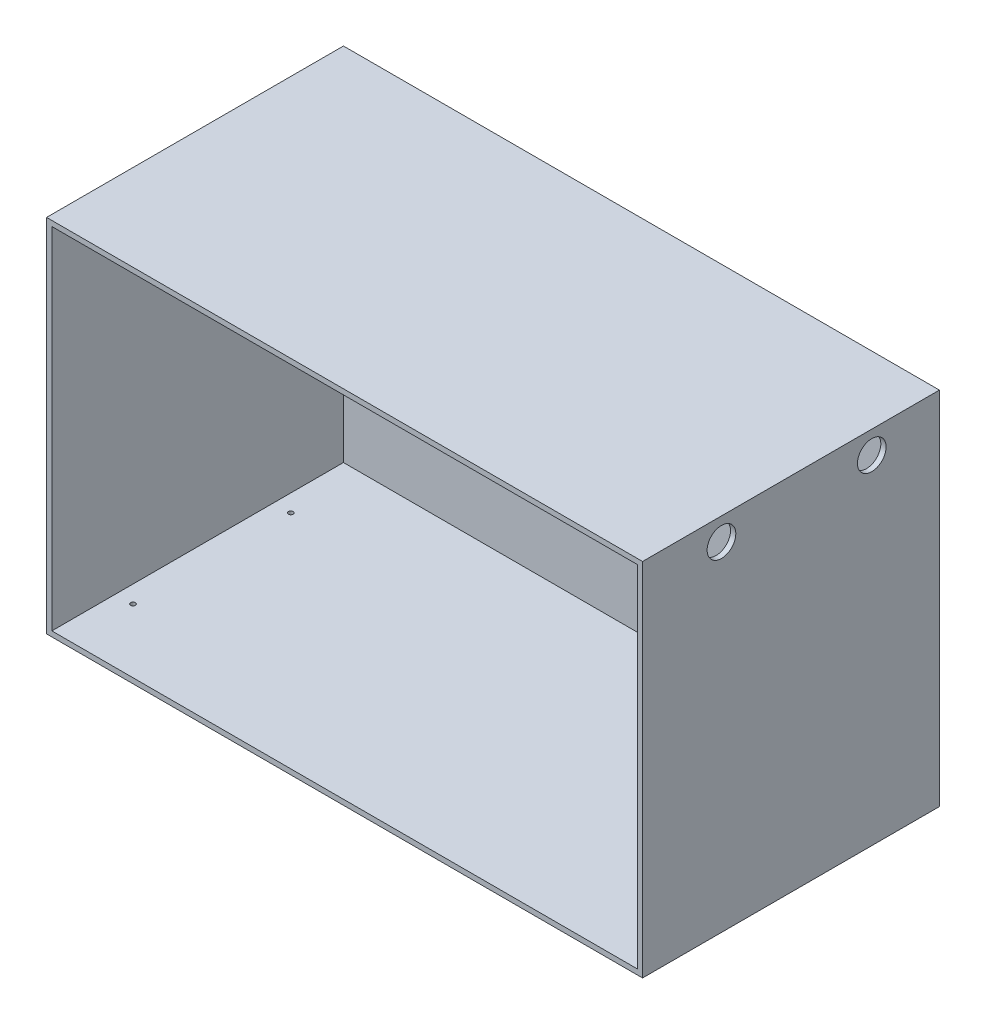
ISO-10303-21;
HEADER;
FILE_DESCRIPTION(('STEP AP214'),'2;1');
FILE_NAME('part.step','',(''),(''),'','','');
FILE_SCHEMA(('AUTOMOTIVE_DESIGN { 1 0 10303 214 1 1 1 1 }'));
ENDSEC;
DATA;
#1=APPLICATION_CONTEXT('core data for automotive mechanical design processes');
#2=APPLICATION_PROTOCOL_DEFINITION('international standard','automotive_design',2000,#1);
#3=PRODUCT_CONTEXT('',#1,'mechanical');
#4=PRODUCT('Part','Part','',(#3));
#5=PRODUCT_RELATED_PRODUCT_CATEGORY('part','',(#4));
#6=PRODUCT_DEFINITION_FORMATION('','',#4);
#7=PRODUCT_DEFINITION_CONTEXT('part definition',#1,'design');
#8=PRODUCT_DEFINITION('design','',#6,#7);
#9=PRODUCT_DEFINITION_SHAPE('','',#8);
#10=(LENGTH_UNIT() NAMED_UNIT(*) SI_UNIT(.MILLI.,.METRE.));
#11=(NAMED_UNIT(*) PLANE_ANGLE_UNIT() SI_UNIT($,.RADIAN.));
#12=(NAMED_UNIT(*) SI_UNIT($,.STERADIAN.) SOLID_ANGLE_UNIT());
#13=UNCERTAINTY_MEASURE_WITH_UNIT(LENGTH_MEASURE(1.E-05),#10,'distance_accuracy_value','');
#14=(GEOMETRIC_REPRESENTATION_CONTEXT(3) GLOBAL_UNCERTAINTY_ASSIGNED_CONTEXT((#13)) GLOBAL_UNIT_ASSIGNED_CONTEXT((#10,
#11,#12)) REPRESENTATION_CONTEXT('',''));
#15=CARTESIAN_POINT('',(0.,0.,0.));
#16=DIRECTION('',(0.,0.,1.));
#17=DIRECTION('',(1.,0.,0.));
#18=AXIS2_PLACEMENT_3D('',#15,#16,#17);
#19=CARTESIAN_POINT('',(396.5,480.,-220.));
#20=DIRECTION('',(-1.,0.,0.));
#21=DIRECTION('',(0.,0.,1.));
#22=AXIS2_PLACEMENT_3D('',#19,#20,#21);
#23=PLANE('',#22);
#24=CARTESIAN_POINT('',(396.5,450.,70.));
#25=DIRECTION('',(-1.,0.,0.));
#26=DIRECTION('',(0.,0.,1.));
#27=AXIS2_PLACEMENT_3D('',#24,#25,#26);
#28=CIRCLE('',#27,19.05);
#29=CARTESIAN_POINT('',(396.5,450.,89.05));
#30=VERTEX_POINT('',#29);
#31=EDGE_CURVE('E168',#30,#30,#28,.T.);
#32=ORIENTED_EDGE('',*,*,#31,.T.);
#33=EDGE_LOOP('',(#32));
#34=FACE_BOUND('',#33,.T.);
#35=CARTESIAN_POINT('',(396.5,450.,-130.));
#36=DIRECTION('',(-1.,0.,0.));
#37=DIRECTION('',(0.,0.,1.));
#38=AXIS2_PLACEMENT_3D('',#35,#36,#37);
#39=CIRCLE('',#38,19.05);
#40=CARTESIAN_POINT('',(396.5,450.,-110.95));
#41=VERTEX_POINT('',#40);
#42=EDGE_CURVE('E175',#41,#41,#39,.T.);
#43=ORIENTED_EDGE('',*,*,#42,.T.);
#44=EDGE_LOOP('',(#43));
#45=FACE_BOUND('',#44,.T.);
#46=DIRECTION('',(0.,0.,-1.));
#47=VECTOR('',#46,1.);
#48=CARTESIAN_POINT('',(396.5,480.,-220.));
#49=LINE('',#48,#47);
#50=CARTESIAN_POINT('',(396.5,480.,175.));
#51=VERTEX_POINT('',#50);
#52=CARTESIAN_POINT('',(396.5,480.,-220.));
#53=VERTEX_POINT('',#52);
#54=EDGE_CURVE('E105',#51,#53,#49,.T.);
#55=ORIENTED_EDGE('',*,*,#54,.F.);
#56=DIRECTION('',(0.,1.,0.));
#57=VECTOR('',#56,1.);
#58=CARTESIAN_POINT('',(396.5,0.,175.));
#59=LINE('',#58,#57);
#60=CARTESIAN_POINT('',(396.5,0.,175.));
#61=VERTEX_POINT('',#60);
#62=EDGE_CURVE('E93',#61,#51,#59,.T.);
#63=ORIENTED_EDGE('',*,*,#62,.F.);
#64=DIRECTION('',(0.,0.,-1.));
#65=VECTOR('',#64,1.);
#66=CARTESIAN_POINT('',(396.5,0.,-220.));
#67=LINE('',#66,#65);
#68=CARTESIAN_POINT('',(396.5,0.,-220.));
#69=VERTEX_POINT('',#68);
#70=EDGE_CURVE('E125',#61,#69,#67,.T.);
#71=ORIENTED_EDGE('',*,*,#70,.T.);
#72=DIRECTION('',(0.,-1.,0.));
#73=VECTOR('',#72,1.);
#74=CARTESIAN_POINT('',(396.5,480.,-220.));
#75=LINE('',#74,#73);
#76=EDGE_CURVE('E39',#53,#69,#75,.T.);
#77=ORIENTED_EDGE('',*,*,#76,.F.);
#78=EDGE_LOOP('',(#55,#63,#71,#77));
#79=FACE_BOUND('',#78,.T.);
#80=ADVANCED_FACE('F32',(#34,#45,#79),#23,.F.);
#81=CARTESIAN_POINT('',(-396.5,480.,-220.));
#82=DIRECTION('',(0.,0.,1.));
#83=DIRECTION('',(1.,0.,0.));
#84=AXIS2_PLACEMENT_3D('',#81,#82,#83);
#85=PLANE('',#84);
#86=DIRECTION('',(-1.,0.,0.));
#87=VECTOR('',#86,1.);
#88=CARTESIAN_POINT('',(-396.5,0.,-220.));
#89=LINE('',#88,#87);
#90=CARTESIAN_POINT('',(-396.5,0.,-220.));
#91=VERTEX_POINT('',#90);
#92=EDGE_CURVE('E117',#69,#91,#89,.T.);
#93=ORIENTED_EDGE('',*,*,#92,.T.);
#94=DIRECTION('',(0.,-1.,0.));
#95=VECTOR('',#94,1.);
#96=CARTESIAN_POINT('',(-396.5,480.,-220.));
#97=LINE('',#96,#95);
#98=CARTESIAN_POINT('',(-396.5,480.,-220.));
#99=VERTEX_POINT('',#98);
#100=EDGE_CURVE('E124',#99,#91,#97,.T.);
#101=ORIENTED_EDGE('',*,*,#100,.F.);
#102=DIRECTION('',(-1.,0.,0.));
#103=VECTOR('',#102,1.);
#104=CARTESIAN_POINT('',(-396.5,480.,-220.));
#105=LINE('',#104,#103);
#106=EDGE_CURVE('E112',#53,#99,#105,.T.);
#107=ORIENTED_EDGE('',*,*,#106,.F.);
#108=ORIENTED_EDGE('',*,*,#76,.T.);
#109=EDGE_LOOP('',(#93,#101,#107,#108));
#110=FACE_BOUND('',#109,.T.);
#111=ADVANCED_FACE('F235',(#110),#85,.F.);
#112=CARTESIAN_POINT('',(-396.5,480.,-220.));
#113=DIRECTION('',(1.,0.,0.));
#114=DIRECTION('',(0.,0.,-1.));
#115=AXIS2_PLACEMENT_3D('',#112,#113,#114);
#116=PLANE('',#115);
#117=CARTESIAN_POINT('',(-396.5,450.,70.));
#118=DIRECTION('',(-1.,0.,0.));
#119=DIRECTION('',(0.,0.,1.));
#120=AXIS2_PLACEMENT_3D('',#117,#118,#119);
#121=CIRCLE('',#120,19.05);
#122=CARTESIAN_POINT('',(-396.5,450.,89.05));
#123=VERTEX_POINT('',#122);
#124=EDGE_CURVE('E141',#123,#123,#121,.T.);
#125=ORIENTED_EDGE('',*,*,#124,.F.);
#126=EDGE_LOOP('',(#125));
#127=FACE_BOUND('',#126,.T.);
#128=CARTESIAN_POINT('',(-396.5,450.,-130.));
#129=DIRECTION('',(-1.,0.,0.));
#130=DIRECTION('',(0.,0.,1.));
#131=AXIS2_PLACEMENT_3D('',#128,#129,#130);
#132=CIRCLE('',#131,19.05);
#133=CARTESIAN_POINT('',(-396.5,450.,-110.95));
#134=VERTEX_POINT('',#133);
#135=EDGE_CURVE('E136',#134,#134,#132,.T.);
#136=ORIENTED_EDGE('',*,*,#135,.F.);
#137=EDGE_LOOP('',(#136));
#138=FACE_BOUND('',#137,.T.);
#139=DIRECTION('',(0.,0.,1.));
#140=VECTOR('',#139,1.);
#141=CARTESIAN_POINT('',(-396.5,0.,-220.));
#142=LINE('',#141,#140);
#143=CARTESIAN_POINT('',(-396.5,0.,175.));
#144=VERTEX_POINT('',#143);
#145=EDGE_CURVE('E113',#91,#144,#142,.T.);
#146=ORIENTED_EDGE('',*,*,#145,.T.);
#147=DIRECTION('',(0.,-1.,0.));
#148=VECTOR('',#147,1.);
#149=CARTESIAN_POINT('',(-396.5,0.,175.));
#150=LINE('',#149,#148);
#151=CARTESIAN_POINT('',(-396.5,480.,175.));
#152=VERTEX_POINT('',#151);
#153=EDGE_CURVE('E46',#152,#144,#150,.T.);
#154=ORIENTED_EDGE('',*,*,#153,.F.);
#155=DIRECTION('',(0.,0.,1.));
#156=VECTOR('',#155,1.);
#157=CARTESIAN_POINT('',(-396.5,480.,-220.));
#158=LINE('',#157,#156);
#159=EDGE_CURVE('E108',#99,#152,#158,.T.);
#160=ORIENTED_EDGE('',*,*,#159,.F.);
#161=ORIENTED_EDGE('',*,*,#100,.T.);
#162=EDGE_LOOP('',(#146,#154,#160,#161));
#163=FACE_BOUND('',#162,.T.);
#164=ADVANCED_FACE('F237',(#127,#138,#163),#116,.F.);
#165=CARTESIAN_POINT('',(0.,480.,0.));
#166=DIRECTION('',(0.,1.,0.));
#167=DIRECTION('',(0.,0.,1.));
#168=AXIS2_PLACEMENT_3D('',#165,#166,#167);
#169=PLANE('',#168);
#170=DIRECTION('',(-1.,0.,0.));
#171=VECTOR('',#170,1.);
#172=CARTESIAN_POINT('',(-396.5,480.,175.));
#173=LINE('',#172,#171);
#174=EDGE_CURVE('E96',#51,#152,#173,.T.);
#175=ORIENTED_EDGE('',*,*,#174,.F.);
#176=ORIENTED_EDGE('',*,*,#54,.T.);
#177=ORIENTED_EDGE('',*,*,#106,.T.);
#178=ORIENTED_EDGE('',*,*,#159,.T.);
#179=EDGE_LOOP('',(#175,#176,#177,#178));
#180=FACE_BOUND('',#179,.T.);
#181=ADVANCED_FACE('F104',(#180),#169,.T.);
#182=CARTESIAN_POINT('',(0.,0.,0.));
#183=DIRECTION('',(0.,1.,0.));
#184=DIRECTION('',(0.,0.,1.));
#185=AXIS2_PLACEMENT_3D('',#182,#183,#184);
#186=PLANE('',#185);
#187=CARTESIAN_POINT('',(366.5,0.,-120.));
#188=DIRECTION('',(0.,-1.,0.));
#189=DIRECTION('',(0.,0.,1.));
#190=AXIS2_PLACEMENT_3D('',#187,#188,#189);
#191=CIRCLE('',#190,3.17499999999997);
#192=CARTESIAN_POINT('',(366.5,0.,-116.825));
#193=VERTEX_POINT('',#192);
#194=EDGE_CURVE('E150',#193,#193,#191,.T.);
#195=ORIENTED_EDGE('',*,*,#194,.F.);
#196=EDGE_LOOP('',(#195));
#197=FACE_BOUND('',#196,.T.);
#198=CARTESIAN_POINT('',(-366.5,0.,90.));
#199=DIRECTION('',(0.,-1.,0.));
#200=DIRECTION('',(0.,0.,1.));
#201=AXIS2_PLACEMENT_3D('',#198,#199,#200);
#202=CIRCLE('',#201,3.17499999999997);
#203=CARTESIAN_POINT('',(-366.5,0.,93.175));
#204=VERTEX_POINT('',#203);
#205=EDGE_CURVE('E215',#204,#204,#202,.T.);
#206=ORIENTED_EDGE('',*,*,#205,.F.);
#207=EDGE_LOOP('',(#206));
#208=FACE_BOUND('',#207,.T.);
#209=CARTESIAN_POINT('',(366.5,0.,90.));
#210=DIRECTION('',(0.,-1.,0.));
#211=DIRECTION('',(0.,0.,-1.));
#212=AXIS2_PLACEMENT_3D('',#209,#210,#211);
#213=CIRCLE('',#212,3.17499999999997);
#214=CARTESIAN_POINT('',(366.5,0.,86.825));
#215=VERTEX_POINT('',#214);
#216=EDGE_CURVE('E162',#215,#215,#213,.T.);
#217=ORIENTED_EDGE('',*,*,#216,.F.);
#218=EDGE_LOOP('',(#217));
#219=FACE_BOUND('',#218,.T.);
#220=CARTESIAN_POINT('',(-366.5,0.,-120.));
#221=DIRECTION('',(0.,-1.,0.));
#222=DIRECTION('',(0.,0.,-1.));
#223=AXIS2_PLACEMENT_3D('',#220,#221,#222);
#224=CIRCLE('',#223,3.17499999999997);
#225=CARTESIAN_POINT('',(-366.5,0.,-123.175));
#226=VERTEX_POINT('',#225);
#227=EDGE_CURVE('E145',#226,#226,#224,.T.);
#228=ORIENTED_EDGE('',*,*,#227,.F.);
#229=EDGE_LOOP('',(#228));
#230=FACE_BOUND('',#229,.T.);
#231=ORIENTED_EDGE('',*,*,#70,.F.);
#232=DIRECTION('',(1.,0.,0.));
#233=VECTOR('',#232,1.);
#234=CARTESIAN_POINT('',(-396.5,0.,175.));
#235=LINE('',#234,#233);
#236=EDGE_CURVE('E97',#144,#61,#235,.T.);
#237=ORIENTED_EDGE('',*,*,#236,.F.);
#238=ORIENTED_EDGE('',*,*,#145,.F.);
#239=ORIENTED_EDGE('',*,*,#92,.F.);
#240=EDGE_LOOP('',(#231,#237,#238,#239));
#241=FACE_BOUND('',#240,.T.);
#242=ADVANCED_FACE('F224',(#197,#208,#219,#230,#241),#186,.F.);
#243=CARTESIAN_POINT('',(389.5,480.,-220.));
#244=DIRECTION('',(-1.,0.,0.));
#245=DIRECTION('',(0.,0.,1.));
#246=AXIS2_PLACEMENT_3D('',#243,#244,#245);
#247=PLANE('',#246);
#248=DIRECTION('',(0.,-1.,0.));
#249=VECTOR('',#248,1.);
#250=CARTESIAN_POINT('',(389.5,480.,175.));
#251=LINE('',#250,#249);
#252=CARTESIAN_POINT('',(389.5,473.,175.));
#253=VERTEX_POINT('',#252);
#254=CARTESIAN_POINT('',(389.5,7.00000000000001,175.));
#255=VERTEX_POINT('',#254);
#256=EDGE_CURVE('E53',#253,#255,#251,.T.);
#257=ORIENTED_EDGE('',*,*,#256,.F.);
#258=DIRECTION('',(0.,0.,-1.));
#259=VECTOR('',#258,1.);
#260=CARTESIAN_POINT('',(389.5,473.,-220.));
#261=LINE('',#260,#259);
#262=CARTESIAN_POINT('',(389.5,473.,-213.));
#263=VERTEX_POINT('',#262);
#264=EDGE_CURVE('E184',#253,#263,#261,.T.);
#265=ORIENTED_EDGE('',*,*,#264,.T.);
#266=DIRECTION('',(0.,-1.,0.));
#267=VECTOR('',#266,1.);
#268=CARTESIAN_POINT('',(389.5,480.,-213.));
#269=LINE('',#268,#267);
#270=CARTESIAN_POINT('',(389.5,7.,-213.));
#271=VERTEX_POINT('',#270);
#272=EDGE_CURVE('E127',#263,#271,#269,.T.);
#273=ORIENTED_EDGE('',*,*,#272,.T.);
#274=DIRECTION('',(0.,0.,-1.));
#275=VECTOR('',#274,1.);
#276=CARTESIAN_POINT('',(389.5,7.00000000000001,-220.));
#277=LINE('',#276,#275);
#278=EDGE_CURVE('E178',#255,#271,#277,.T.);
#279=ORIENTED_EDGE('',*,*,#278,.F.);
#280=EDGE_LOOP('',(#257,#265,#273,#279));
#281=FACE_BOUND('',#280,.T.);
#282=CARTESIAN_POINT('',(389.5,450.,70.));
#283=DIRECTION('',(-1.,0.,0.));
#284=DIRECTION('',(0.,0.,1.));
#285=AXIS2_PLACEMENT_3D('',#282,#283,#284);
#286=CIRCLE('',#285,19.05);
#287=CARTESIAN_POINT('',(389.5,450.,89.05));
#288=VERTEX_POINT('',#287);
#289=EDGE_CURVE('E140',#288,#288,#286,.T.);
#290=ORIENTED_EDGE('',*,*,#289,.F.);
#291=EDGE_LOOP('',(#290));
#292=FACE_BOUND('',#291,.T.);
#293=CARTESIAN_POINT('',(389.5,450.,-130.));
#294=DIRECTION('',(-1.,0.,0.));
#295=DIRECTION('',(0.,0.,1.));
#296=AXIS2_PLACEMENT_3D('',#293,#294,#295);
#297=CIRCLE('',#296,19.05);
#298=CARTESIAN_POINT('',(389.5,450.,-110.95));
#299=VERTEX_POINT('',#298);
#300=EDGE_CURVE('E135',#299,#299,#297,.T.);
#301=ORIENTED_EDGE('',*,*,#300,.F.);
#302=EDGE_LOOP('',(#301));
#303=FACE_BOUND('',#302,.T.);
#304=ADVANCED_FACE('F227',(#281,#292,#303),#247,.T.);
#305=CARTESIAN_POINT('',(-396.5,480.,-213.));
#306=DIRECTION('',(0.,0.,1.));
#307=DIRECTION('',(1.,0.,0.));
#308=AXIS2_PLACEMENT_3D('',#305,#306,#307);
#309=PLANE('',#308);
#310=DIRECTION('',(-1.,0.,0.));
#311=VECTOR('',#310,1.);
#312=CARTESIAN_POINT('',(-396.5,7.00000000000001,-213.));
#313=LINE('',#312,#311);
#314=CARTESIAN_POINT('',(-389.5,7.,-213.));
#315=VERTEX_POINT('',#314);
#316=EDGE_CURVE('E180',#271,#315,#313,.T.);
#317=ORIENTED_EDGE('',*,*,#316,.F.);
#318=ORIENTED_EDGE('',*,*,#272,.F.);
#319=DIRECTION('',(-1.,0.,0.));
#320=VECTOR('',#319,1.);
#321=CARTESIAN_POINT('',(-396.5,473.,-213.));
#322=LINE('',#321,#320);
#323=CARTESIAN_POINT('',(-389.5,473.,-213.));
#324=VERTEX_POINT('',#323);
#325=EDGE_CURVE('E186',#263,#324,#322,.T.);
#326=ORIENTED_EDGE('',*,*,#325,.T.);
#327=DIRECTION('',(0.,-1.,0.));
#328=VECTOR('',#327,1.);
#329=CARTESIAN_POINT('',(-389.5,480.,-213.));
#330=LINE('',#329,#328);
#331=EDGE_CURVE('E183',#324,#315,#330,.T.);
#332=ORIENTED_EDGE('',*,*,#331,.T.);
#333=EDGE_LOOP('',(#317,#318,#326,#332));
#334=FACE_BOUND('',#333,.T.);
#335=ADVANCED_FACE('F274',(#334),#309,.T.);
#336=CARTESIAN_POINT('',(-389.5,480.,-220.));
#337=DIRECTION('',(1.,0.,0.));
#338=DIRECTION('',(0.,0.,-1.));
#339=AXIS2_PLACEMENT_3D('',#336,#337,#338);
#340=PLANE('',#339);
#341=DIRECTION('',(0.,1.,0.));
#342=VECTOR('',#341,1.);
#343=CARTESIAN_POINT('',(-389.5,480.,175.));
#344=LINE('',#343,#342);
#345=CARTESIAN_POINT('',(-389.5,7.,175.));
#346=VERTEX_POINT('',#345);
#347=CARTESIAN_POINT('',(-389.5,473.,175.));
#348=VERTEX_POINT('',#347);
#349=EDGE_CURVE('E205',#346,#348,#344,.T.);
#350=ORIENTED_EDGE('',*,*,#349,.F.);
#351=DIRECTION('',(0.,0.,1.));
#352=VECTOR('',#351,1.);
#353=CARTESIAN_POINT('',(-389.5,7.00000000000001,-220.));
#354=LINE('',#353,#352);
#355=EDGE_CURVE('E187',#315,#346,#354,.T.);
#356=ORIENTED_EDGE('',*,*,#355,.F.);
#357=ORIENTED_EDGE('',*,*,#331,.F.);
#358=DIRECTION('',(0.,0.,1.));
#359=VECTOR('',#358,1.);
#360=CARTESIAN_POINT('',(-389.5,473.,-220.));
#361=LINE('',#360,#359);
#362=EDGE_CURVE('E120',#324,#348,#361,.T.);
#363=ORIENTED_EDGE('',*,*,#362,.T.);
#364=EDGE_LOOP('',(#350,#356,#357,#363));
#365=FACE_BOUND('',#364,.T.);
#366=CARTESIAN_POINT('',(-389.5,450.,70.));
#367=DIRECTION('',(1.,0.,0.));
#368=DIRECTION('',(0.,0.,-1.));
#369=AXIS2_PLACEMENT_3D('',#366,#367,#368);
#370=CIRCLE('',#369,19.05);
#371=CARTESIAN_POINT('',(-389.5,450.,50.95));
#372=VERTEX_POINT('',#371);
#373=EDGE_CURVE('E137',#372,#372,#370,.T.);
#374=ORIENTED_EDGE('',*,*,#373,.F.);
#375=EDGE_LOOP('',(#374));
#376=FACE_BOUND('',#375,.T.);
#377=CARTESIAN_POINT('',(-389.5,450.,-130.));
#378=DIRECTION('',(1.,0.,0.));
#379=DIRECTION('',(0.,0.,-1.));
#380=AXIS2_PLACEMENT_3D('',#377,#378,#379);
#381=CIRCLE('',#380,19.05);
#382=CARTESIAN_POINT('',(-389.5,450.,-149.05));
#383=VERTEX_POINT('',#382);
#384=EDGE_CURVE('E132',#383,#383,#381,.T.);
#385=ORIENTED_EDGE('',*,*,#384,.F.);
#386=EDGE_LOOP('',(#385));
#387=FACE_BOUND('',#386,.T.);
#388=ADVANCED_FACE('F201',(#365,#376,#387),#340,.T.);
#389=CARTESIAN_POINT('',(0.,473.,0.));
#390=DIRECTION('',(0.,1.,0.));
#391=DIRECTION('',(0.,0.,1.));
#392=AXIS2_PLACEMENT_3D('',#389,#390,#391);
#393=PLANE('',#392);
#394=ORIENTED_EDGE('',*,*,#264,.F.);
#395=DIRECTION('',(-1.,0.,0.));
#396=VECTOR('',#395,1.);
#397=CARTESIAN_POINT('',(0.,473.,175.));
#398=LINE('',#397,#396);
#399=EDGE_CURVE('E208',#253,#348,#398,.T.);
#400=ORIENTED_EDGE('',*,*,#399,.T.);
#401=ORIENTED_EDGE('',*,*,#362,.F.);
#402=ORIENTED_EDGE('',*,*,#325,.F.);
#403=EDGE_LOOP('',(#394,#400,#401,#402));
#404=FACE_BOUND('',#403,.T.);
#405=ADVANCED_FACE('F281',(#404),#393,.F.);
#406=CARTESIAN_POINT('',(0.,7.,0.));
#407=DIRECTION('',(0.,1.,0.));
#408=DIRECTION('',(0.,0.,1.));
#409=AXIS2_PLACEMENT_3D('',#406,#407,#408);
#410=PLANE('',#409);
#411=DIRECTION('',(-1.,0.,0.));
#412=VECTOR('',#411,1.);
#413=CARTESIAN_POINT('',(0.,7.,175.));
#414=LINE('',#413,#412);
#415=EDGE_CURVE('E11',#255,#346,#414,.T.);
#416=ORIENTED_EDGE('',*,*,#415,.F.);
#417=ORIENTED_EDGE('',*,*,#278,.T.);
#418=ORIENTED_EDGE('',*,*,#316,.T.);
#419=ORIENTED_EDGE('',*,*,#355,.T.);
#420=EDGE_LOOP('',(#416,#417,#418,#419));
#421=FACE_BOUND('',#420,.T.);
#422=CARTESIAN_POINT('',(366.5,7.,-120.));
#423=DIRECTION('',(0.,1.,0.));
#424=DIRECTION('',(0.,0.,1.));
#425=AXIS2_PLACEMENT_3D('',#422,#423,#424);
#426=CIRCLE('',#425,3.17499999999997);
#427=CARTESIAN_POINT('',(366.5,7.,-116.825));
#428=VERTEX_POINT('',#427);
#429=EDGE_CURVE('E152',#428,#428,#426,.T.);
#430=ORIENTED_EDGE('',*,*,#429,.F.);
#431=EDGE_LOOP('',(#430));
#432=FACE_BOUND('',#431,.T.);
#433=CARTESIAN_POINT('',(-366.5,7.,90.));
#434=DIRECTION('',(0.,1.,0.));
#435=DIRECTION('',(0.,0.,1.));
#436=AXIS2_PLACEMENT_3D('',#433,#434,#435);
#437=CIRCLE('',#436,3.17499999999997);
#438=CARTESIAN_POINT('',(-366.5,7.,93.175));
#439=VERTEX_POINT('',#438);
#440=EDGE_CURVE('E149',#439,#439,#437,.T.);
#441=ORIENTED_EDGE('',*,*,#440,.F.);
#442=EDGE_LOOP('',(#441));
#443=FACE_BOUND('',#442,.T.);
#444=CARTESIAN_POINT('',(366.5,7.,90.));
#445=DIRECTION('',(0.,1.,0.));
#446=DIRECTION('',(0.,0.,1.));
#447=AXIS2_PLACEMENT_3D('',#444,#445,#446);
#448=CIRCLE('',#447,3.17499999999997);
#449=CARTESIAN_POINT('',(366.5,7.,93.175));
#450=VERTEX_POINT('',#449);
#451=EDGE_CURVE('E146',#450,#450,#448,.T.);
#452=ORIENTED_EDGE('',*,*,#451,.F.);
#453=EDGE_LOOP('',(#452));
#454=FACE_BOUND('',#453,.T.);
#455=CARTESIAN_POINT('',(-366.5,7.,-120.));
#456=DIRECTION('',(0.,1.,0.));
#457=DIRECTION('',(0.,0.,1.));
#458=AXIS2_PLACEMENT_3D('',#455,#456,#457);
#459=CIRCLE('',#458,3.17499999999997);
#460=CARTESIAN_POINT('',(-366.5,7.,-116.825));
#461=VERTEX_POINT('',#460);
#462=EDGE_CURVE('E142',#461,#461,#459,.T.);
#463=ORIENTED_EDGE('',*,*,#462,.F.);
#464=EDGE_LOOP('',(#463));
#465=FACE_BOUND('',#464,.T.);
#466=ADVANCED_FACE('F194',(#421,#432,#443,#454,#465),#410,.T.);
#467=CARTESIAN_POINT('',(451.5,450.,-130.));
#468=DIRECTION('',(-1.,0.,0.));
#469=DIRECTION('',(0.,0.,1.));
#470=AXIS2_PLACEMENT_3D('',#467,#468,#469);
#471=CYLINDRICAL_SURFACE('',#470,19.05);
#472=ORIENTED_EDGE('',*,*,#384,.T.);
#473=EDGE_LOOP('',(#472));
#474=FACE_BOUND('',#473,.T.);
#475=ORIENTED_EDGE('',*,*,#135,.T.);
#476=EDGE_LOOP('',(#475));
#477=FACE_BOUND('',#476,.T.);
#478=ADVANCED_FACE('F259',(#474,#477),#471,.F.);
#479=ORIENTED_EDGE('',*,*,#300,.T.);
#480=EDGE_LOOP('',(#479));
#481=FACE_BOUND('',#480,.T.);
#482=ORIENTED_EDGE('',*,*,#42,.F.);
#483=EDGE_LOOP('',(#482));
#484=FACE_BOUND('',#483,.T.);
#485=ADVANCED_FACE('F256',(#481,#484),#471,.F.);
#486=CARTESIAN_POINT('',(451.5,450.,70.));
#487=DIRECTION('',(-1.,0.,0.));
#488=DIRECTION('',(0.,0.,1.));
#489=AXIS2_PLACEMENT_3D('',#486,#487,#488);
#490=CYLINDRICAL_SURFACE('',#489,19.05);
#491=ORIENTED_EDGE('',*,*,#373,.T.);
#492=EDGE_LOOP('',(#491));
#493=FACE_BOUND('',#492,.T.);
#494=ORIENTED_EDGE('',*,*,#124,.T.);
#495=EDGE_LOOP('',(#494));
#496=FACE_BOUND('',#495,.T.);
#497=ADVANCED_FACE('F258',(#493,#496),#490,.F.);
#498=ORIENTED_EDGE('',*,*,#289,.T.);
#499=EDGE_LOOP('',(#498));
#500=FACE_BOUND('',#499,.T.);
#501=ORIENTED_EDGE('',*,*,#31,.F.);
#502=EDGE_LOOP('',(#501));
#503=FACE_BOUND('',#502,.T.);
#504=ADVANCED_FACE('F266',(#500,#503),#490,.F.);
#505=CARTESIAN_POINT('',(-366.5,10.,-120.));
#506=DIRECTION('',(0.,-1.,0.));
#507=DIRECTION('',(0.,0.,-1.));
#508=AXIS2_PLACEMENT_3D('',#505,#506,#507);
#509=CYLINDRICAL_SURFACE('',#508,3.17499999999997);
#510=ORIENTED_EDGE('',*,*,#462,.T.);
#511=EDGE_LOOP('',(#510));
#512=FACE_BOUND('',#511,.T.);
#513=ORIENTED_EDGE('',*,*,#227,.T.);
#514=EDGE_LOOP('',(#513));
#515=FACE_BOUND('',#514,.T.);
#516=ADVANCED_FACE('F316',(#512,#515),#509,.F.);
#517=CARTESIAN_POINT('',(366.5,10.,90.));
#518=DIRECTION('',(0.,-1.,0.));
#519=DIRECTION('',(0.,0.,-1.));
#520=AXIS2_PLACEMENT_3D('',#517,#518,#519);
#521=CYLINDRICAL_SURFACE('',#520,3.17499999999997);
#522=ORIENTED_EDGE('',*,*,#451,.T.);
#523=EDGE_LOOP('',(#522));
#524=FACE_BOUND('',#523,.T.);
#525=ORIENTED_EDGE('',*,*,#216,.T.);
#526=EDGE_LOOP('',(#525));
#527=FACE_BOUND('',#526,.T.);
#528=ADVANCED_FACE('F222',(#524,#527),#521,.F.);
#529=CARTESIAN_POINT('',(-366.5,10.,90.));
#530=DIRECTION('',(0.,-1.,0.));
#531=DIRECTION('',(0.,0.,-1.));
#532=AXIS2_PLACEMENT_3D('',#529,#530,#531);
#533=CYLINDRICAL_SURFACE('',#532,3.17499999999997);
#534=ORIENTED_EDGE('',*,*,#440,.T.);
#535=EDGE_LOOP('',(#534));
#536=FACE_BOUND('',#535,.T.);
#537=ORIENTED_EDGE('',*,*,#205,.T.);
#538=EDGE_LOOP('',(#537));
#539=FACE_BOUND('',#538,.T.);
#540=ADVANCED_FACE('F335',(#536,#539),#533,.F.);
#541=CARTESIAN_POINT('',(366.5,10.,-120.));
#542=DIRECTION('',(0.,-1.,0.));
#543=DIRECTION('',(0.,0.,-1.));
#544=AXIS2_PLACEMENT_3D('',#541,#542,#543);
#545=CYLINDRICAL_SURFACE('',#544,3.17499999999997);
#546=ORIENTED_EDGE('',*,*,#429,.T.);
#547=EDGE_LOOP('',(#546));
#548=FACE_BOUND('',#547,.T.);
#549=ORIENTED_EDGE('',*,*,#194,.T.);
#550=EDGE_LOOP('',(#549));
#551=FACE_BOUND('',#550,.T.);
#552=ADVANCED_FACE('F345',(#548,#551),#545,.F.);
#553=CARTESIAN_POINT('',(0.,0.,175.));
#554=DIRECTION('',(0.,0.,-1.));
#555=DIRECTION('',(-1.,0.,0.));
#556=AXIS2_PLACEMENT_3D('',#553,#554,#555);
#557=PLANE('',#556);
#558=ORIENTED_EDGE('',*,*,#62,.T.);
#559=ORIENTED_EDGE('',*,*,#174,.T.);
#560=ORIENTED_EDGE('',*,*,#153,.T.);
#561=ORIENTED_EDGE('',*,*,#236,.T.);
#562=EDGE_LOOP('',(#558,#559,#560,#561));
#563=FACE_BOUND('',#562,.T.);
#564=ORIENTED_EDGE('',*,*,#256,.T.);
#565=ORIENTED_EDGE('',*,*,#415,.T.);
#566=ORIENTED_EDGE('',*,*,#349,.T.);
#567=ORIENTED_EDGE('',*,*,#399,.F.);
#568=EDGE_LOOP('',(#564,#565,#566,#567));
#569=FACE_BOUND('',#568,.T.);
#570=ADVANCED_FACE('F95',(#563,#569),#557,.F.);
#571=CLOSED_SHELL('',(#80,#111,#164,#181,#242,#304,#335,#388,#405,#466,#478,#485,#497,#504,#516,
#528,#540,#552,#570));
#572=MANIFOLD_SOLID_BREP('B2',#571);
#573=ADVANCED_BREP_SHAPE_REPRESENTATION('',(#18,#572),#14);
#574=SHAPE_DEFINITION_REPRESENTATION(#9,#573);
ENDSEC;
END-ISO-10303-21;
